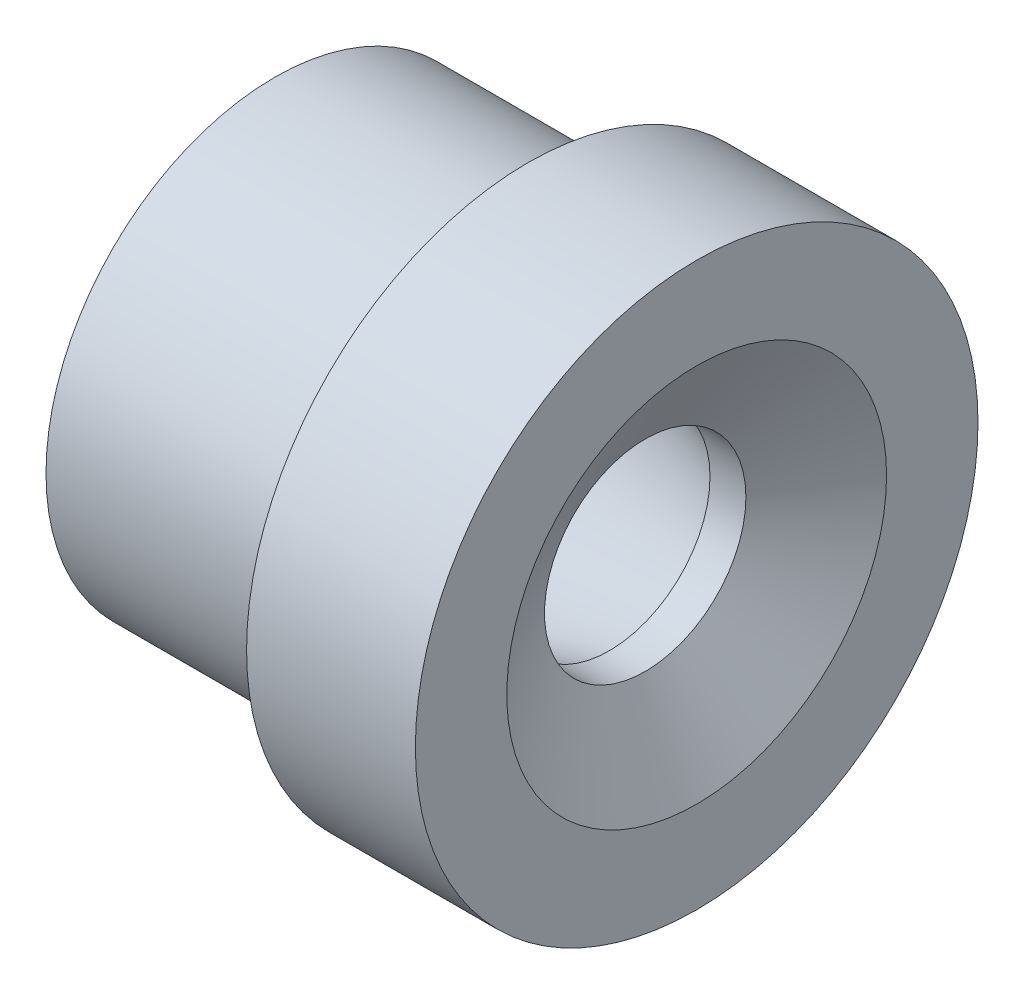
ISO-10303-21;
HEADER;
FILE_DESCRIPTION(('STEP AP214'),'2;1');
FILE_NAME('part.step','',(''),(''),'','','');
FILE_SCHEMA(('AUTOMOTIVE_DESIGN { 1 0 10303 214 1 1 1 1 }'));
ENDSEC;
DATA;
#1=APPLICATION_CONTEXT('core data for automotive mechanical design processes');
#2=APPLICATION_PROTOCOL_DEFINITION('international standard','automotive_design',2000,#1);
#3=PRODUCT_CONTEXT('',#1,'mechanical');
#4=PRODUCT('Part','Part','',(#3));
#5=PRODUCT_RELATED_PRODUCT_CATEGORY('part','',(#4));
#6=PRODUCT_DEFINITION_FORMATION('','',#4);
#7=PRODUCT_DEFINITION_CONTEXT('part definition',#1,'design');
#8=PRODUCT_DEFINITION('design','',#6,#7);
#9=PRODUCT_DEFINITION_SHAPE('','',#8);
#10=(LENGTH_UNIT() NAMED_UNIT(*) SI_UNIT(.MILLI.,.METRE.));
#11=(NAMED_UNIT(*) PLANE_ANGLE_UNIT() SI_UNIT($,.RADIAN.));
#12=(NAMED_UNIT(*) SI_UNIT($,.STERADIAN.) SOLID_ANGLE_UNIT());
#13=UNCERTAINTY_MEASURE_WITH_UNIT(LENGTH_MEASURE(1.E-05),#10,'distance_accuracy_value','');
#14=(GEOMETRIC_REPRESENTATION_CONTEXT(3) GLOBAL_UNCERTAINTY_ASSIGNED_CONTEXT((#13)) GLOBAL_UNIT_ASSIGNED_CONTEXT((#10,
#11,#12)) REPRESENTATION_CONTEXT('',''));
#15=CARTESIAN_POINT('',(0.,0.,0.));
#16=DIRECTION('',(0.,0.,1.));
#17=DIRECTION('',(1.,0.,0.));
#18=AXIS2_PLACEMENT_3D('',#15,#16,#17);
#19=CARTESIAN_POINT('',(5.11872970120267,0.,-12.7));
#20=DIRECTION('',(1.,0.,0.));
#21=DIRECTION('',(0.,0.,-1.));
#22=AXIS2_PLACEMENT_3D('',#19,#20,#21);
#23=CYLINDRICAL_SURFACE('',#22,12.7);
#24=CARTESIAN_POINT('',(0.,0.,-12.7));
#25=DIRECTION('',(1.,0.,0.));
#26=DIRECTION('',(0.,0.,-1.));
#27=AXIS2_PLACEMENT_3D('',#24,#25,#26);
#28=CIRCLE('',#27,12.7);
#29=CARTESIAN_POINT('',(0.,0.,-25.4));
#30=VERTEX_POINT('',#29);
#31=EDGE_CURVE('E10',#30,#30,#28,.T.);
#32=ORIENTED_EDGE('',*,*,#31,.F.);
#33=EDGE_LOOP('',(#32));
#34=FACE_BOUND('',#33,.T.);
#35=CARTESIAN_POINT('',(-7.62,0.,-12.7));
#36=DIRECTION('',(1.,0.,0.));
#37=DIRECTION('',(0.,0.,-1.));
#38=AXIS2_PLACEMENT_3D('',#35,#36,#37);
#39=CIRCLE('',#38,12.7);
#40=CARTESIAN_POINT('',(-7.62000000000001,0.,-25.4));
#41=VERTEX_POINT('',#40);
#42=EDGE_CURVE('E70',#41,#41,#39,.T.);
#43=ORIENTED_EDGE('',*,*,#42,.T.);
#44=EDGE_LOOP('',(#43));
#45=FACE_BOUND('',#44,.T.);
#46=ADVANCED_FACE('F39',(#34,#45),#23,.T.);
#47=CARTESIAN_POINT('',(0.,0.,0.));
#48=DIRECTION('',(-1.,0.,0.));
#49=DIRECTION('',(0.,0.,1.));
#50=AXIS2_PLACEMENT_3D('',#47,#48,#49);
#51=PLANE('',#50);
#52=CARTESIAN_POINT('',(0.,0.,-12.7));
#53=DIRECTION('',(1.,0.,0.));
#54=DIRECTION('',(0.,0.,-1.));
#55=AXIS2_PLACEMENT_3D('',#52,#53,#54);
#56=CIRCLE('',#55,8.5725);
#57=CARTESIAN_POINT('',(0.,0.,-21.2725));
#58=VERTEX_POINT('',#57);
#59=EDGE_CURVE('E44',#58,#58,#56,.T.);
#60=ORIENTED_EDGE('',*,*,#59,.F.);
#61=EDGE_LOOP('',(#60));
#62=FACE_BOUND('',#61,.T.);
#63=ORIENTED_EDGE('',*,*,#31,.T.);
#64=EDGE_LOOP('',(#63));
#65=FACE_BOUND('',#64,.T.);
#66=ADVANCED_FACE('F102',(#62,#65),#51,.F.);
#67=CARTESIAN_POINT('',(0.,0.,-12.7));
#68=DIRECTION('',(1.,0.,0.));
#69=DIRECTION('',(0.,0.,-1.));
#70=AXIS2_PLACEMENT_3D('',#67,#68,#69);
#71=CONICAL_SURFACE('',#70,8.5725,1.0471975511966);
#72=CARTESIAN_POINT('',(-2.32435444873051,0.,-12.7));
#73=DIRECTION('',(1.,0.,0.));
#74=DIRECTION('',(0.,0.,-1.));
#75=AXIS2_PLACEMENT_3D('',#72,#73,#74);
#76=CIRCLE('',#75,4.5466);
#77=CARTESIAN_POINT('',(-2.32435444873051,0.,-17.2466));
#78=VERTEX_POINT('',#77);
#79=EDGE_CURVE('E47',#78,#78,#76,.T.);
#80=ORIENTED_EDGE('',*,*,#79,.F.);
#81=EDGE_LOOP('',(#80));
#82=FACE_BOUND('',#81,.T.);
#83=ORIENTED_EDGE('',*,*,#59,.T.);
#84=EDGE_LOOP('',(#83));
#85=FACE_BOUND('',#84,.T.);
#86=ADVANCED_FACE('F97',(#82,#85),#71,.F.);
#87=CARTESIAN_POINT('',(5.11872970120267,0.,-12.7));
#88=DIRECTION('',(1.,0.,0.));
#89=DIRECTION('',(0.,0.,-1.));
#90=AXIS2_PLACEMENT_3D('',#87,#88,#89);
#91=CYLINDRICAL_SURFACE('',#90,4.5466);
#92=CARTESIAN_POINT('',(-3.94487444873051,0.,-12.7));
#93=DIRECTION('',(1.,0.,0.));
#94=DIRECTION('',(0.,0.,-1.));
#95=AXIS2_PLACEMENT_3D('',#92,#93,#94);
#96=CIRCLE('',#95,4.5466);
#97=CARTESIAN_POINT('',(-3.94487444873051,0.,-17.2466));
#98=VERTEX_POINT('',#97);
#99=EDGE_CURVE('E52',#98,#98,#96,.T.);
#100=ORIENTED_EDGE('',*,*,#99,.F.);
#101=EDGE_LOOP('',(#100));
#102=FACE_BOUND('',#101,.T.);
#103=ORIENTED_EDGE('',*,*,#79,.T.);
#104=EDGE_LOOP('',(#103));
#105=FACE_BOUND('',#104,.T.);
#106=ADVANCED_FACE('F91',(#102,#105),#91,.F.);
#107=CARTESIAN_POINT('',(-3.94487444873051,0.,-12.7));
#108=DIRECTION('',(-1.,0.,0.));
#109=DIRECTION('',(0.,0.,1.));
#110=AXIS2_PLACEMENT_3D('',#107,#108,#109);
#111=CONICAL_SURFACE('',#110,4.5466,0.26179938779915);
#112=CARTESIAN_POINT('',(-19.05,0.,-12.7));
#113=DIRECTION('',(1.,0.,0.));
#114=DIRECTION('',(0.,0.,-1.));
#115=AXIS2_PLACEMENT_3D('',#112,#113,#114);
#116=CIRCLE('',#115,8.59400619303339);
#117=CARTESIAN_POINT('',(-19.05,0.,-21.2940061930334));
#118=VERTEX_POINT('',#117);
#119=EDGE_CURVE('E59',#118,#118,#116,.T.);
#120=ORIENTED_EDGE('',*,*,#119,.F.);
#121=EDGE_LOOP('',(#120));
#122=FACE_BOUND('',#121,.T.);
#123=ORIENTED_EDGE('',*,*,#99,.T.);
#124=EDGE_LOOP('',(#123));
#125=FACE_BOUND('',#124,.T.);
#126=ADVANCED_FACE('F87',(#122,#125),#111,.F.);
#127=CARTESIAN_POINT('',(-19.05,0.,-4.10599380696661));
#128=DIRECTION('',(1.,0.,0.));
#129=DIRECTION('',(0.,0.,-1.));
#130=AXIS2_PLACEMENT_3D('',#127,#128,#129);
#131=PLANE('',#130);
#132=CARTESIAN_POINT('',(-19.05,0.,-12.7));
#133=DIRECTION('',(1.,0.,0.));
#134=DIRECTION('',(0.,0.,-1.));
#135=AXIS2_PLACEMENT_3D('',#132,#133,#134);
#136=CIRCLE('',#135,10.3251);
#137=CARTESIAN_POINT('',(-19.05,0.,-23.0251));
#138=VERTEX_POINT('',#137);
#139=EDGE_CURVE('E62',#138,#138,#136,.T.);
#140=ORIENTED_EDGE('',*,*,#139,.F.);
#141=EDGE_LOOP('',(#140));
#142=FACE_BOUND('',#141,.T.);
#143=ORIENTED_EDGE('',*,*,#119,.T.);
#144=EDGE_LOOP('',(#143));
#145=FACE_BOUND('',#144,.T.);
#146=ADVANCED_FACE('F82',(#142,#145),#131,.F.);
#147=CARTESIAN_POINT('',(5.11872970120267,0.,-12.7));
#148=DIRECTION('',(1.,0.,0.));
#149=DIRECTION('',(0.,0.,-1.));
#150=AXIS2_PLACEMENT_3D('',#147,#148,#149);
#151=CYLINDRICAL_SURFACE('',#150,10.3251);
#152=CARTESIAN_POINT('',(-7.62,0.,-12.7));
#153=DIRECTION('',(1.,0.,0.));
#154=DIRECTION('',(0.,0.,-1.));
#155=AXIS2_PLACEMENT_3D('',#152,#153,#154);
#156=CIRCLE('',#155,10.3251);
#157=CARTESIAN_POINT('',(-7.62,0.,-23.0251));
#158=VERTEX_POINT('',#157);
#159=EDGE_CURVE('E61',#158,#158,#156,.T.);
#160=ORIENTED_EDGE('',*,*,#159,.F.);
#161=EDGE_LOOP('',(#160));
#162=FACE_BOUND('',#161,.T.);
#163=ORIENTED_EDGE('',*,*,#139,.T.);
#164=EDGE_LOOP('',(#163));
#165=FACE_BOUND('',#164,.T.);
#166=ADVANCED_FACE('F73',(#162,#165),#151,.T.);
#167=CARTESIAN_POINT('',(-7.62,0.,-2.3749));
#168=DIRECTION('',(1.,0.,0.));
#169=DIRECTION('',(0.,0.,-1.));
#170=AXIS2_PLACEMENT_3D('',#167,#168,#169);
#171=PLANE('',#170);
#172=ORIENTED_EDGE('',*,*,#42,.F.);
#173=EDGE_LOOP('',(#172));
#174=FACE_BOUND('',#173,.T.);
#175=ORIENTED_EDGE('',*,*,#159,.T.);
#176=EDGE_LOOP('',(#175));
#177=FACE_BOUND('',#176,.T.);
#178=ADVANCED_FACE('F75',(#174,#177),#171,.F.);
#179=CLOSED_SHELL('',(#46,#66,#86,#106,#126,#146,#166,#178));
#180=MANIFOLD_SOLID_BREP('B2',#179);
#181=ADVANCED_BREP_SHAPE_REPRESENTATION('',(#18,#180),#14);
#182=SHAPE_DEFINITION_REPRESENTATION(#9,#181);
ENDSEC;
END-ISO-10303-21;
